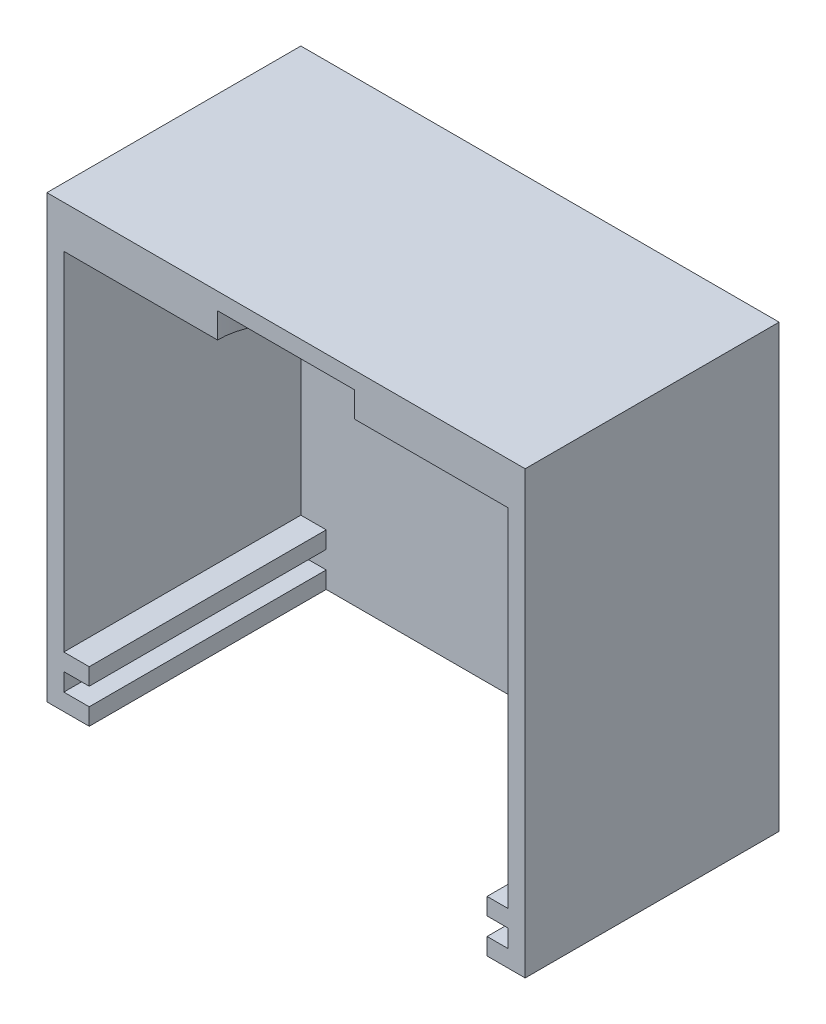
ISO-10303-21;
HEADER;
FILE_DESCRIPTION(('STEP AP214'),'2;1');
FILE_NAME('part.step','',(''),(''),'','','');
FILE_SCHEMA(('AUTOMOTIVE_DESIGN { 1 0 10303 214 1 1 1 1 }'));
ENDSEC;
DATA;
#1=APPLICATION_CONTEXT('core data for automotive mechanical design processes');
#2=APPLICATION_PROTOCOL_DEFINITION('international standard','automotive_design',2000,#1);
#3=PRODUCT_CONTEXT('',#1,'mechanical');
#4=PRODUCT('Part','Part','',(#3));
#5=PRODUCT_RELATED_PRODUCT_CATEGORY('part','',(#4));
#6=PRODUCT_DEFINITION_FORMATION('','',#4);
#7=PRODUCT_DEFINITION_CONTEXT('part definition',#1,'design');
#8=PRODUCT_DEFINITION('design','',#6,#7);
#9=PRODUCT_DEFINITION_SHAPE('','',#8);
#10=(LENGTH_UNIT() NAMED_UNIT(*) SI_UNIT(.MILLI.,.METRE.));
#11=(NAMED_UNIT(*) PLANE_ANGLE_UNIT() SI_UNIT($,.RADIAN.));
#12=(NAMED_UNIT(*) SI_UNIT($,.STERADIAN.) SOLID_ANGLE_UNIT());
#13=UNCERTAINTY_MEASURE_WITH_UNIT(LENGTH_MEASURE(1.E-05),#10,'distance_accuracy_value','');
#14=(GEOMETRIC_REPRESENTATION_CONTEXT(3) GLOBAL_UNCERTAINTY_ASSIGNED_CONTEXT((#13)) GLOBAL_UNIT_ASSIGNED_CONTEXT((#10,
#11,#12)) REPRESENTATION_CONTEXT('',''));
#15=CARTESIAN_POINT('',(0.,0.,0.));
#16=DIRECTION('',(0.,0.,1.));
#17=DIRECTION('',(1.,0.,0.));
#18=AXIS2_PLACEMENT_3D('',#15,#16,#17);
#19=CARTESIAN_POINT('',(0.,0.,2.));
#20=DIRECTION('',(0.,0.,1.));
#21=DIRECTION('',(1.,0.,0.));
#22=AXIS2_PLACEMENT_3D('',#19,#20,#21);
#23=PLANE('',#22);
#24=DIRECTION('',(0.,1.,0.));
#25=VECTOR('',#24,1.);
#26=CARTESIAN_POINT('',(-51.5,0.,2.));
#27=LINE('',#26,#25);
#28=CARTESIAN_POINT('',(-51.5,7.89999999999999,2.));
#29=VERTEX_POINT('',#28);
#30=CARTESIAN_POINT('',(-51.5,9.89999999999999,2.));
#31=VERTEX_POINT('',#30);
#32=EDGE_CURVE('E286',#29,#31,#27,.T.);
#33=ORIENTED_EDGE('',*,*,#32,.F.);
#34=DIRECTION('',(1.,0.,0.));
#35=VECTOR('',#34,1.);
#36=CARTESIAN_POINT('',(0.,7.9,2.));
#37=LINE('',#36,#35);
#38=CARTESIAN_POINT('',(-4.5,7.9,2.));
#39=VERTEX_POINT('',#38);
#40=EDGE_CURVE('E197',#29,#39,#37,.T.);
#41=ORIENTED_EDGE('',*,*,#40,.T.);
#42=DIRECTION('',(0.,-1.,0.));
#43=VECTOR('',#42,1.);
#44=CARTESIAN_POINT('',(-4.5,0.,2.));
#45=LINE('',#44,#43);
#46=CARTESIAN_POINT('',(-4.5,9.89999999999999,2.));
#47=VERTEX_POINT('',#46);
#48=EDGE_CURVE('E58',#47,#39,#45,.T.);
#49=ORIENTED_EDGE('',*,*,#48,.F.);
#50=DIRECTION('',(-1.,0.,0.));
#51=VECTOR('',#50,1.);
#52=CARTESIAN_POINT('',(0.,9.89999999999999,2.));
#53=LINE('',#52,#51);
#54=CARTESIAN_POINT('',(-2.,9.89999999999999,2.));
#55=VERTEX_POINT('',#54);
#56=EDGE_CURVE('E334',#55,#47,#53,.T.);
#57=ORIENTED_EDGE('',*,*,#56,.F.);
#58=DIRECTION('',(0.,1.,0.));
#59=VECTOR('',#58,1.);
#60=CARTESIAN_POINT('',(-2.,0.,2.));
#61=LINE('',#60,#59);
#62=CARTESIAN_POINT('',(-2.,12.,2.));
#63=VERTEX_POINT('',#62);
#64=EDGE_CURVE('E229',#55,#63,#61,.T.);
#65=ORIENTED_EDGE('',*,*,#64,.T.);
#66=DIRECTION('',(1.,0.,0.));
#67=VECTOR('',#66,1.);
#68=CARTESIAN_POINT('',(0.,12.,2.));
#69=LINE('',#68,#67);
#70=CARTESIAN_POINT('',(-4.5,12.,2.));
#71=VERTEX_POINT('',#70);
#72=EDGE_CURVE('E311',#71,#63,#69,.T.);
#73=ORIENTED_EDGE('',*,*,#72,.F.);
#74=DIRECTION('',(0.,-1.,0.));
#75=VECTOR('',#74,1.);
#76=CARTESIAN_POINT('',(-4.5,0.,2.));
#77=LINE('',#76,#75);
#78=CARTESIAN_POINT('',(-4.5,14.,2.));
#79=VERTEX_POINT('',#78);
#80=EDGE_CURVE('E317',#79,#71,#77,.T.);
#81=ORIENTED_EDGE('',*,*,#80,.F.);
#82=DIRECTION('',(-1.,0.,0.));
#83=VECTOR('',#82,1.);
#84=CARTESIAN_POINT('',(0.,14.,2.));
#85=LINE('',#84,#83);
#86=CARTESIAN_POINT('',(-2.,14.,2.));
#87=VERTEX_POINT('',#86);
#88=EDGE_CURVE('E299',#87,#79,#85,.T.);
#89=ORIENTED_EDGE('',*,*,#88,.F.);
#90=CARTESIAN_POINT('',(-2.,55.,2.));
#91=VERTEX_POINT('',#90);
#92=EDGE_CURVE('E231',#87,#91,#61,.T.);
#93=ORIENTED_EDGE('',*,*,#92,.T.);
#94=DIRECTION('',(1.,0.,0.));
#95=VECTOR('',#94,1.);
#96=CARTESIAN_POINT('',(-54.5,55.,2.));
#97=LINE('',#96,#95);
#98=CARTESIAN_POINT('',(-54.5,55.,2.));
#99=VERTEX_POINT('',#98);
#100=EDGE_CURVE('E238',#99,#91,#97,.T.);
#101=ORIENTED_EDGE('',*,*,#100,.F.);
#102=DIRECTION('',(0.,-1.,0.));
#103=VECTOR('',#102,1.);
#104=CARTESIAN_POINT('',(-54.5,0.,2.));
#105=LINE('',#104,#103);
#106=CARTESIAN_POINT('',(-54.5,14.,2.));
#107=VERTEX_POINT('',#106);
#108=EDGE_CURVE('E225',#99,#107,#105,.T.);
#109=ORIENTED_EDGE('',*,*,#108,.T.);
#110=DIRECTION('',(1.,0.,0.));
#111=VECTOR('',#110,1.);
#112=CARTESIAN_POINT('',(0.,14.,2.));
#113=LINE('',#112,#111);
#114=CARTESIAN_POINT('',(-51.5,14.,2.));
#115=VERTEX_POINT('',#114);
#116=EDGE_CURVE('E259',#107,#115,#113,.T.);
#117=ORIENTED_EDGE('',*,*,#116,.T.);
#118=DIRECTION('',(0.,1.,0.));
#119=VECTOR('',#118,1.);
#120=CARTESIAN_POINT('',(-51.5,0.,2.));
#121=LINE('',#120,#119);
#122=CARTESIAN_POINT('',(-51.5,12.,2.));
#123=VERTEX_POINT('',#122);
#124=EDGE_CURVE('E261',#123,#115,#121,.T.);
#125=ORIENTED_EDGE('',*,*,#124,.F.);
#126=DIRECTION('',(-1.,0.,0.));
#127=VECTOR('',#126,1.);
#128=CARTESIAN_POINT('',(0.,12.,2.));
#129=LINE('',#128,#127);
#130=CARTESIAN_POINT('',(-54.5,12.,2.));
#131=VERTEX_POINT('',#130);
#132=EDGE_CURVE('E253',#123,#131,#129,.T.);
#133=ORIENTED_EDGE('',*,*,#132,.T.);
#134=CARTESIAN_POINT('',(-54.5,9.89999999999999,2.));
#135=VERTEX_POINT('',#134);
#136=EDGE_CURVE('E228',#131,#135,#105,.T.);
#137=ORIENTED_EDGE('',*,*,#136,.T.);
#138=DIRECTION('',(1.,0.,0.));
#139=VECTOR('',#138,1.);
#140=CARTESIAN_POINT('',(0.,9.9,2.));
#141=LINE('',#140,#139);
#142=EDGE_CURVE('E278',#135,#31,#141,.T.);
#143=ORIENTED_EDGE('',*,*,#142,.T.);
#144=EDGE_LOOP('',(#33,#41,#49,#57,#65,#73,#81,#89,#93,#101,#109,#117,#125,#133,#137,#143));
#145=FACE_BOUND('',#144,.T.);
#146=ADVANCED_FACE('F35',(#145),#23,.T.);
#147=CARTESIAN_POINT('',(0.,0.,30.));
#148=DIRECTION('',(-1.,0.,0.));
#149=DIRECTION('',(0.,0.,1.));
#150=AXIS2_PLACEMENT_3D('',#147,#148,#149);
#151=PLANE('',#150);
#152=DIRECTION('',(0.,0.,1.));
#153=VECTOR('',#152,1.);
#154=CARTESIAN_POINT('',(0.,7.9,30.));
#155=LINE('',#154,#153);
#156=CARTESIAN_POINT('',(0.,7.9,0.));
#157=VERTEX_POINT('',#156);
#158=CARTESIAN_POINT('',(0.,7.9,30.));
#159=VERTEX_POINT('',#158);
#160=EDGE_CURVE('E185',#157,#159,#155,.T.);
#161=ORIENTED_EDGE('',*,*,#160,.F.);
#162=DIRECTION('',(0.,1.,0.));
#163=VECTOR('',#162,1.);
#164=CARTESIAN_POINT('',(0.,0.,0.));
#165=LINE('',#164,#163);
#166=CARTESIAN_POINT('',(0.,60.,0.));
#167=VERTEX_POINT('',#166);
#168=EDGE_CURVE('E194',#157,#167,#165,.T.);
#169=ORIENTED_EDGE('',*,*,#168,.T.);
#170=DIRECTION('',(0.,0.,-1.));
#171=VECTOR('',#170,1.);
#172=CARTESIAN_POINT('',(0.,60.,30.));
#173=LINE('',#172,#171);
#174=CARTESIAN_POINT('',(0.,60.,30.));
#175=VERTEX_POINT('',#174);
#176=EDGE_CURVE('E11',#175,#167,#173,.T.);
#177=ORIENTED_EDGE('',*,*,#176,.F.);
#178=DIRECTION('',(0.,1.,0.));
#179=VECTOR('',#178,1.);
#180=CARTESIAN_POINT('',(0.,0.,30.));
#181=LINE('',#180,#179);
#182=EDGE_CURVE('E196',#159,#175,#181,.T.);
#183=ORIENTED_EDGE('',*,*,#182,.F.);
#184=EDGE_LOOP('',(#161,#169,#177,#183));
#185=FACE_BOUND('',#184,.T.);
#186=ADVANCED_FACE('F37',(#185),#151,.F.);
#187=CARTESIAN_POINT('',(-56.5,0.,30.));
#188=DIRECTION('',(1.,0.,0.));
#189=DIRECTION('',(0.,0.,-1.));
#190=AXIS2_PLACEMENT_3D('',#187,#188,#189);
#191=PLANE('',#190);
#192=DIRECTION('',(0.,0.,-1.));
#193=VECTOR('',#192,1.);
#194=CARTESIAN_POINT('',(-56.5,7.89999999999999,30.));
#195=LINE('',#194,#193);
#196=CARTESIAN_POINT('',(-56.5,7.89999999999999,30.));
#197=VERTEX_POINT('',#196);
#198=CARTESIAN_POINT('',(-56.5,7.9,0.));
#199=VERTEX_POINT('',#198);
#200=EDGE_CURVE('E50',#197,#199,#195,.T.);
#201=ORIENTED_EDGE('',*,*,#200,.F.);
#202=DIRECTION('',(0.,-1.,0.));
#203=VECTOR('',#202,1.);
#204=CARTESIAN_POINT('',(-56.5,0.,30.));
#205=LINE('',#204,#203);
#206=CARTESIAN_POINT('',(-56.5,60.,30.));
#207=VERTEX_POINT('',#206);
#208=EDGE_CURVE('E208',#207,#197,#205,.T.);
#209=ORIENTED_EDGE('',*,*,#208,.F.);
#210=DIRECTION('',(0.,0.,-1.));
#211=VECTOR('',#210,1.);
#212=CARTESIAN_POINT('',(-56.5,60.,30.));
#213=LINE('',#212,#211);
#214=CARTESIAN_POINT('',(-56.5,60.,0.));
#215=VERTEX_POINT('',#214);
#216=EDGE_CURVE('E43',#207,#215,#213,.T.);
#217=ORIENTED_EDGE('',*,*,#216,.T.);
#218=DIRECTION('',(0.,-1.,0.));
#219=VECTOR('',#218,1.);
#220=CARTESIAN_POINT('',(-56.5,0.,0.));
#221=LINE('',#220,#219);
#222=EDGE_CURVE('E203',#215,#199,#221,.T.);
#223=ORIENTED_EDGE('',*,*,#222,.T.);
#224=EDGE_LOOP('',(#201,#209,#217,#223));
#225=FACE_BOUND('',#224,.T.);
#226=ADVANCED_FACE('F421',(#225),#191,.F.);
#227=CARTESIAN_POINT('',(0.,0.,30.));
#228=DIRECTION('',(0.,0.,1.));
#229=DIRECTION('',(1.,0.,0.));
#230=AXIS2_PLACEMENT_3D('',#227,#228,#229);
#231=PLANE('',#230);
#232=ORIENTED_EDGE('',*,*,#208,.T.);
#233=DIRECTION('',(-1.,0.,0.));
#234=VECTOR('',#233,1.);
#235=CARTESIAN_POINT('',(-51.5,7.89999999999999,30.));
#236=LINE('',#235,#234);
#237=CARTESIAN_POINT('',(-51.5,7.89999999999999,30.));
#238=VERTEX_POINT('',#237);
#239=EDGE_CURVE('E289',#238,#197,#236,.T.);
#240=ORIENTED_EDGE('',*,*,#239,.F.);
#241=DIRECTION('',(0.,-1.,0.));
#242=VECTOR('',#241,1.);
#243=CARTESIAN_POINT('',(-51.5,9.89999999999999,30.));
#244=LINE('',#243,#242);
#245=CARTESIAN_POINT('',(-51.5,9.89999999999999,30.));
#246=VERTEX_POINT('',#245);
#247=EDGE_CURVE('E298',#246,#238,#244,.T.);
#248=ORIENTED_EDGE('',*,*,#247,.F.);
#249=DIRECTION('',(-1.,0.,0.));
#250=VECTOR('',#249,1.);
#251=CARTESIAN_POINT('',(-51.5,9.89999999999999,30.));
#252=LINE('',#251,#250);
#253=CARTESIAN_POINT('',(-54.5,9.89999999999999,30.));
#254=VERTEX_POINT('',#253);
#255=EDGE_CURVE('E291',#246,#254,#252,.T.);
#256=ORIENTED_EDGE('',*,*,#255,.T.);
#257=DIRECTION('',(0.,-1.,0.));
#258=VECTOR('',#257,1.);
#259=CARTESIAN_POINT('',(-54.5,0.,30.));
#260=LINE('',#259,#258);
#261=CARTESIAN_POINT('',(-54.5,12.,30.));
#262=VERTEX_POINT('',#261);
#263=EDGE_CURVE('E205',#262,#254,#260,.T.);
#264=ORIENTED_EDGE('',*,*,#263,.F.);
#265=DIRECTION('',(-1.,0.,0.));
#266=VECTOR('',#265,1.);
#267=CARTESIAN_POINT('',(-51.5,12.,30.));
#268=LINE('',#267,#266);
#269=CARTESIAN_POINT('',(-51.5,12.,30.));
#270=VERTEX_POINT('',#269);
#271=EDGE_CURVE('E264',#270,#262,#268,.T.);
#272=ORIENTED_EDGE('',*,*,#271,.F.);
#273=DIRECTION('',(0.,-1.,0.));
#274=VECTOR('',#273,1.);
#275=CARTESIAN_POINT('',(-51.5,14.,30.));
#276=LINE('',#275,#274);
#277=CARTESIAN_POINT('',(-51.5,14.,30.));
#278=VERTEX_POINT('',#277);
#279=EDGE_CURVE('E274',#278,#270,#276,.T.);
#280=ORIENTED_EDGE('',*,*,#279,.F.);
#281=DIRECTION('',(-1.,0.,0.));
#282=VECTOR('',#281,1.);
#283=CARTESIAN_POINT('',(-51.5,14.,30.));
#284=LINE('',#283,#282);
#285=CARTESIAN_POINT('',(-54.5,14.,30.));
#286=VERTEX_POINT('',#285);
#287=EDGE_CURVE('E267',#278,#286,#284,.T.);
#288=ORIENTED_EDGE('',*,*,#287,.T.);
#289=CARTESIAN_POINT('',(-54.5,55.,30.));
#290=VERTEX_POINT('',#289);
#291=EDGE_CURVE('E201',#290,#286,#260,.T.);
#292=ORIENTED_EDGE('',*,*,#291,.F.);
#293=DIRECTION('',(1.,0.,0.));
#294=VECTOR('',#293,1.);
#295=CARTESIAN_POINT('',(-54.5,55.,30.));
#296=LINE('',#295,#294);
#297=CARTESIAN_POINT('',(-36.35,55.,30.));
#298=VERTEX_POINT('',#297);
#299=EDGE_CURVE('E237',#290,#298,#296,.T.);
#300=ORIENTED_EDGE('',*,*,#299,.T.);
#301=DIRECTION('',(0.,-1.,0.));
#302=VECTOR('',#301,1.);
#303=CARTESIAN_POINT('',(-36.35,58.,30.));
#304=LINE('',#303,#302);
#305=CARTESIAN_POINT('',(-36.35,58.,30.));
#306=VERTEX_POINT('',#305);
#307=EDGE_CURVE('E242',#306,#298,#304,.T.);
#308=ORIENTED_EDGE('',*,*,#307,.F.);
#309=DIRECTION('',(-1.,0.,0.));
#310=VECTOR('',#309,1.);
#311=CARTESIAN_POINT('',(-36.35,58.,30.));
#312=LINE('',#311,#310);
#313=CARTESIAN_POINT('',(-20.15,58.,30.));
#314=VERTEX_POINT('',#313);
#315=EDGE_CURVE('E248',#314,#306,#312,.T.);
#316=ORIENTED_EDGE('',*,*,#315,.F.);
#317=DIRECTION('',(0.,-1.,0.));
#318=VECTOR('',#317,1.);
#319=CARTESIAN_POINT('',(-20.15,58.,30.));
#320=LINE('',#319,#318);
#321=CARTESIAN_POINT('',(-20.15,55.,30.));
#322=VERTEX_POINT('',#321);
#323=EDGE_CURVE('E245',#314,#322,#320,.T.);
#324=ORIENTED_EDGE('',*,*,#323,.T.);
#325=CARTESIAN_POINT('',(-2.,55.,30.));
#326=VERTEX_POINT('',#325);
#327=EDGE_CURVE('E241',#322,#326,#296,.T.);
#328=ORIENTED_EDGE('',*,*,#327,.T.);
#329=DIRECTION('',(0.,1.,0.));
#330=VECTOR('',#329,1.);
#331=CARTESIAN_POINT('',(-2.,0.,30.));
#332=LINE('',#331,#330);
#333=CARTESIAN_POINT('',(-2.,14.,30.));
#334=VERTEX_POINT('',#333);
#335=EDGE_CURVE('E224',#334,#326,#332,.T.);
#336=ORIENTED_EDGE('',*,*,#335,.F.);
#337=DIRECTION('',(1.,0.,0.));
#338=VECTOR('',#337,1.);
#339=CARTESIAN_POINT('',(-4.5,14.,30.));
#340=LINE('',#339,#338);
#341=CARTESIAN_POINT('',(-4.5,14.,30.));
#342=VERTEX_POINT('',#341);
#343=EDGE_CURVE('E320',#342,#334,#340,.T.);
#344=ORIENTED_EDGE('',*,*,#343,.F.);
#345=DIRECTION('',(0.,-1.,0.));
#346=VECTOR('',#345,1.);
#347=CARTESIAN_POINT('',(-4.5,14.,30.));
#348=LINE('',#347,#346);
#349=CARTESIAN_POINT('',(-4.5,12.,30.));
#350=VERTEX_POINT('',#349);
#351=EDGE_CURVE('E331',#342,#350,#348,.T.);
#352=ORIENTED_EDGE('',*,*,#351,.T.);
#353=DIRECTION('',(1.,0.,0.));
#354=VECTOR('',#353,1.);
#355=CARTESIAN_POINT('',(-4.5,12.,30.));
#356=LINE('',#355,#354);
#357=CARTESIAN_POINT('',(-2.,12.,30.));
#358=VERTEX_POINT('',#357);
#359=EDGE_CURVE('E323',#350,#358,#356,.T.);
#360=ORIENTED_EDGE('',*,*,#359,.T.);
#361=CARTESIAN_POINT('',(-2.,9.89999999999999,30.));
#362=VERTEX_POINT('',#361);
#363=EDGE_CURVE('E222',#362,#358,#332,.T.);
#364=ORIENTED_EDGE('',*,*,#363,.F.);
#365=DIRECTION('',(1.,0.,0.));
#366=VECTOR('',#365,1.);
#367=CARTESIAN_POINT('',(-4.5,9.89999999999999,30.));
#368=LINE('',#367,#366);
#369=CARTESIAN_POINT('',(-4.5,9.89999999999999,30.));
#370=VERTEX_POINT('',#369);
#371=EDGE_CURVE('E340',#370,#362,#368,.T.);
#372=ORIENTED_EDGE('',*,*,#371,.F.);
#373=DIRECTION('',(0.,-1.,0.));
#374=VECTOR('',#373,1.);
#375=CARTESIAN_POINT('',(-4.5,9.89999999999999,30.));
#376=LINE('',#375,#374);
#377=CARTESIAN_POINT('',(-4.5,7.89999999999999,30.));
#378=VERTEX_POINT('',#377);
#379=EDGE_CURVE('E350',#370,#378,#376,.T.);
#380=ORIENTED_EDGE('',*,*,#379,.T.);
#381=DIRECTION('',(1.,0.,0.));
#382=VECTOR('',#381,1.);
#383=CARTESIAN_POINT('',(-4.5,7.89999999999999,30.));
#384=LINE('',#383,#382);
#385=EDGE_CURVE('E343',#378,#159,#384,.T.);
#386=ORIENTED_EDGE('',*,*,#385,.T.);
#387=ORIENTED_EDGE('',*,*,#182,.T.);
#388=DIRECTION('',(-1.,0.,0.));
#389=VECTOR('',#388,1.);
#390=CARTESIAN_POINT('',(0.,60.,30.));
#391=LINE('',#390,#389);
#392=EDGE_CURVE('E216',#175,#207,#391,.T.);
#393=ORIENTED_EDGE('',*,*,#392,.T.);
#394=EDGE_LOOP('',(#232,#240,#248,#256,#264,#272,#280,#288,#292,#300,#308,#316,#324,#328,#336,
#344,#352,#360,#364,#372,#380,#386,#387,#393));
#395=FACE_BOUND('',#394,.T.);
#396=ADVANCED_FACE('F361',(#395),#231,.T.);
#397=CARTESIAN_POINT('',(0.,0.,0.));
#398=DIRECTION('',(0.,0.,1.));
#399=DIRECTION('',(1.,0.,0.));
#400=AXIS2_PLACEMENT_3D('',#397,#398,#399);
#401=PLANE('',#400);
#402=DIRECTION('',(1.,0.,0.));
#403=VECTOR('',#402,1.);
#404=CARTESIAN_POINT('',(-56.5,7.89999999999999,0.));
#405=LINE('',#404,#403);
#406=EDGE_CURVE('E182',#199,#157,#405,.T.);
#407=ORIENTED_EDGE('',*,*,#406,.F.);
#408=ORIENTED_EDGE('',*,*,#222,.F.);
#409=DIRECTION('',(-1.,0.,0.));
#410=VECTOR('',#409,1.);
#411=CARTESIAN_POINT('',(0.,60.,0.));
#412=LINE('',#411,#410);
#413=EDGE_CURVE('E200',#167,#215,#412,.T.);
#414=ORIENTED_EDGE('',*,*,#413,.F.);
#415=ORIENTED_EDGE('',*,*,#168,.F.);
#416=EDGE_LOOP('',(#407,#408,#414,#415));
#417=FACE_BOUND('',#416,.T.);
#418=ADVANCED_FACE('F199',(#417),#401,.F.);
#419=CARTESIAN_POINT('',(-2.,0.,30.));
#420=DIRECTION('',(-1.,0.,0.));
#421=DIRECTION('',(0.,0.,1.));
#422=AXIS2_PLACEMENT_3D('',#419,#420,#421);
#423=PLANE('',#422);
#424=DIRECTION('',(0.,0.,-1.));
#425=VECTOR('',#424,1.);
#426=CARTESIAN_POINT('',(-2.,9.89999999999999,30.));
#427=LINE('',#426,#425);
#428=EDGE_CURVE('E336',#362,#55,#427,.T.);
#429=ORIENTED_EDGE('',*,*,#428,.F.);
#430=ORIENTED_EDGE('',*,*,#363,.T.);
#431=DIRECTION('',(0.,0.,1.));
#432=VECTOR('',#431,1.);
#433=CARTESIAN_POINT('',(-2.,12.,30.));
#434=LINE('',#433,#432);
#435=EDGE_CURVE('E314',#63,#358,#434,.T.);
#436=ORIENTED_EDGE('',*,*,#435,.F.);
#437=ORIENTED_EDGE('',*,*,#64,.F.);
#438=EDGE_LOOP('',(#429,#430,#436,#437));
#439=FACE_BOUND('',#438,.T.);
#440=ADVANCED_FACE('F368',(#439),#423,.T.);
#441=DIRECTION('',(0.,0.,-1.));
#442=VECTOR('',#441,1.);
#443=CARTESIAN_POINT('',(-2.,14.,30.));
#444=LINE('',#443,#442);
#445=EDGE_CURVE('E308',#334,#87,#444,.T.);
#446=ORIENTED_EDGE('',*,*,#445,.F.);
#447=ORIENTED_EDGE('',*,*,#335,.T.);
#448=DIRECTION('',(0.,0.,-1.));
#449=VECTOR('',#448,1.);
#450=CARTESIAN_POINT('',(-2.,55.,30.));
#451=LINE('',#450,#449);
#452=EDGE_CURVE('E234',#326,#91,#451,.T.);
#453=ORIENTED_EDGE('',*,*,#452,.T.);
#454=ORIENTED_EDGE('',*,*,#92,.F.);
#455=EDGE_LOOP('',(#446,#447,#453,#454));
#456=FACE_BOUND('',#455,.T.);
#457=ADVANCED_FACE('F384',(#456),#423,.T.);
#458=CARTESIAN_POINT('',(-54.5,0.,30.));
#459=DIRECTION('',(1.,0.,0.));
#460=DIRECTION('',(0.,0.,-1.));
#461=AXIS2_PLACEMENT_3D('',#458,#459,#460);
#462=PLANE('',#461);
#463=ORIENTED_EDGE('',*,*,#263,.T.);
#464=DIRECTION('',(0.,0.,1.));
#465=VECTOR('',#464,1.);
#466=CARTESIAN_POINT('',(-54.5,9.89999999999999,30.));
#467=LINE('',#466,#465);
#468=EDGE_CURVE('E295',#135,#254,#467,.T.);
#469=ORIENTED_EDGE('',*,*,#468,.F.);
#470=ORIENTED_EDGE('',*,*,#136,.F.);
#471=DIRECTION('',(0.,0.,-1.));
#472=VECTOR('',#471,1.);
#473=CARTESIAN_POINT('',(-54.5,12.,30.));
#474=LINE('',#473,#472);
#475=EDGE_CURVE('E275',#262,#131,#474,.T.);
#476=ORIENTED_EDGE('',*,*,#475,.F.);
#477=EDGE_LOOP('',(#463,#469,#470,#476));
#478=FACE_BOUND('',#477,.T.);
#479=ADVANCED_FACE('F413',(#478),#462,.T.);
#480=ORIENTED_EDGE('',*,*,#291,.T.);
#481=DIRECTION('',(0.,0.,1.));
#482=VECTOR('',#481,1.);
#483=CARTESIAN_POINT('',(-54.5,14.,30.));
#484=LINE('',#483,#482);
#485=EDGE_CURVE('E271',#107,#286,#484,.T.);
#486=ORIENTED_EDGE('',*,*,#485,.F.);
#487=ORIENTED_EDGE('',*,*,#108,.F.);
#488=DIRECTION('',(0.,0.,-1.));
#489=VECTOR('',#488,1.);
#490=CARTESIAN_POINT('',(-54.5,55.,30.));
#491=LINE('',#490,#489);
#492=EDGE_CURVE('E232',#290,#99,#491,.T.);
#493=ORIENTED_EDGE('',*,*,#492,.F.);
#494=EDGE_LOOP('',(#480,#486,#487,#493));
#495=FACE_BOUND('',#494,.T.);
#496=ADVANCED_FACE('F394',(#495),#462,.T.);
#497=CARTESIAN_POINT('',(0.,60.,30.));
#498=DIRECTION('',(0.,-1.,0.));
#499=DIRECTION('',(1.,0.,0.));
#500=AXIS2_PLACEMENT_3D('',#497,#498,#499);
#501=PLANE('',#500);
#502=ORIENTED_EDGE('',*,*,#413,.T.);
#503=ORIENTED_EDGE('',*,*,#216,.F.);
#504=ORIENTED_EDGE('',*,*,#392,.F.);
#505=ORIENTED_EDGE('',*,*,#176,.T.);
#506=EDGE_LOOP('',(#502,#503,#504,#505));
#507=FACE_BOUND('',#506,.T.);
#508=ADVANCED_FACE('F447',(#507),#501,.F.);
#509=CARTESIAN_POINT('',(-54.5,55.,30.));
#510=DIRECTION('',(0.,1.,0.));
#511=DIRECTION('',(-1.,0.,0.));
#512=AXIS2_PLACEMENT_3D('',#509,#510,#511);
#513=PLANE('',#512);
#514=ORIENTED_EDGE('',*,*,#327,.F.);
#515=CARTESIAN_POINT('',(-28.25,55.,30.));
#516=DIRECTION('',(0.,-1.,0.));
#517=DIRECTION('',(0.,0.,1.));
#518=AXIS2_PLACEMENT_3D('',#515,#516,#517);
#519=CIRCLE('',#518,8.1);
#520=EDGE_CURVE('E250',#298,#322,#519,.T.);
#521=ORIENTED_EDGE('',*,*,#520,.F.);
#522=ORIENTED_EDGE('',*,*,#299,.F.);
#523=ORIENTED_EDGE('',*,*,#492,.T.);
#524=ORIENTED_EDGE('',*,*,#100,.T.);
#525=ORIENTED_EDGE('',*,*,#452,.F.);
#526=EDGE_LOOP('',(#514,#521,#522,#523,#524,#525));
#527=FACE_BOUND('',#526,.T.);
#528=ADVANCED_FACE('F389',(#527),#513,.F.);
#529=CARTESIAN_POINT('',(-28.25,58.,30.));
#530=DIRECTION('',(0.,-1.,0.));
#531=DIRECTION('',(0.,0.,-1.));
#532=AXIS2_PLACEMENT_3D('',#529,#530,#531);
#533=CYLINDRICAL_SURFACE('',#532,8.1);
#534=ORIENTED_EDGE('',*,*,#520,.T.);
#535=ORIENTED_EDGE('',*,*,#323,.F.);
#536=CARTESIAN_POINT('',(-28.25,58.,30.));
#537=DIRECTION('',(0.,-1.,0.));
#538=DIRECTION('',(0.,0.,1.));
#539=AXIS2_PLACEMENT_3D('',#536,#537,#538);
#540=CIRCLE('',#539,8.1);
#541=EDGE_CURVE('E252',#306,#314,#540,.T.);
#542=ORIENTED_EDGE('',*,*,#541,.F.);
#543=ORIENTED_EDGE('',*,*,#307,.T.);
#544=EDGE_LOOP('',(#534,#535,#542,#543));
#545=FACE_BOUND('',#544,.T.);
#546=ADVANCED_FACE('F446',(#545),#533,.F.);
#547=CARTESIAN_POINT('',(-28.25,58.,30.));
#548=DIRECTION('',(0.,1.,0.));
#549=DIRECTION('',(0.,0.,1.));
#550=AXIS2_PLACEMENT_3D('',#547,#548,#549);
#551=PLANE('',#550);
#552=ORIENTED_EDGE('',*,*,#541,.T.);
#553=ORIENTED_EDGE('',*,*,#315,.T.);
#554=EDGE_LOOP('',(#552,#553));
#555=FACE_BOUND('',#554,.T.);
#556=ADVANCED_FACE('F450',(#555),#551,.F.);
#557=CARTESIAN_POINT('',(-51.5,12.,30.));
#558=DIRECTION('',(0.,1.,0.));
#559=DIRECTION('',(-1.,0.,0.));
#560=AXIS2_PLACEMENT_3D('',#557,#558,#559);
#561=PLANE('',#560);
#562=ORIENTED_EDGE('',*,*,#132,.F.);
#563=DIRECTION('',(0.,0.,-1.));
#564=VECTOR('',#563,1.);
#565=CARTESIAN_POINT('',(-51.5,12.,30.));
#566=LINE('',#565,#564);
#567=EDGE_CURVE('E280',#270,#123,#566,.T.);
#568=ORIENTED_EDGE('',*,*,#567,.F.);
#569=ORIENTED_EDGE('',*,*,#271,.T.);
#570=ORIENTED_EDGE('',*,*,#475,.T.);
#571=EDGE_LOOP('',(#562,#568,#569,#570));
#572=FACE_BOUND('',#571,.T.);
#573=ADVANCED_FACE('F407',(#572),#561,.F.);
#574=CARTESIAN_POINT('',(-51.5,14.,30.));
#575=DIRECTION('',(0.,-1.,0.));
#576=DIRECTION('',(1.,0.,0.));
#577=AXIS2_PLACEMENT_3D('',#574,#575,#576);
#578=PLANE('',#577);
#579=ORIENTED_EDGE('',*,*,#116,.F.);
#580=ORIENTED_EDGE('',*,*,#485,.T.);
#581=ORIENTED_EDGE('',*,*,#287,.F.);
#582=DIRECTION('',(0.,0.,1.));
#583=VECTOR('',#582,1.);
#584=CARTESIAN_POINT('',(-51.5,14.,30.));
#585=LINE('',#584,#583);
#586=EDGE_CURVE('E270',#115,#278,#585,.T.);
#587=ORIENTED_EDGE('',*,*,#586,.F.);
#588=EDGE_LOOP('',(#579,#580,#581,#587));
#589=FACE_BOUND('',#588,.T.);
#590=ADVANCED_FACE('F402',(#589),#578,.F.);
#591=CARTESIAN_POINT('',(-51.5,0.,0.));
#592=DIRECTION('',(1.,0.,0.));
#593=DIRECTION('',(0.,0.,-1.));
#594=AXIS2_PLACEMENT_3D('',#591,#592,#593);
#595=PLANE('',#594);
#596=ORIENTED_EDGE('',*,*,#567,.T.);
#597=ORIENTED_EDGE('',*,*,#124,.T.);
#598=ORIENTED_EDGE('',*,*,#586,.T.);
#599=ORIENTED_EDGE('',*,*,#279,.T.);
#600=EDGE_LOOP('',(#596,#597,#598,#599));
#601=FACE_BOUND('',#600,.T.);
#602=ADVANCED_FACE('F405',(#601),#595,.T.);
#603=CARTESIAN_POINT('',(-51.5,7.89999999999999,30.));
#604=DIRECTION('',(0.,1.,0.));
#605=DIRECTION('',(-1.,0.,0.));
#606=AXIS2_PLACEMENT_3D('',#603,#604,#605);
#607=PLANE('',#606);
#608=ORIENTED_EDGE('',*,*,#239,.T.);
#609=ORIENTED_EDGE('',*,*,#200,.T.);
#610=ORIENTED_EDGE('',*,*,#406,.T.);
#611=ORIENTED_EDGE('',*,*,#160,.T.);
#612=ORIENTED_EDGE('',*,*,#385,.F.);
#613=DIRECTION('',(0.,0.,-1.));
#614=VECTOR('',#613,1.);
#615=CARTESIAN_POINT('',(-4.5,7.89999999999999,30.));
#616=LINE('',#615,#614);
#617=EDGE_CURVE('E345',#378,#39,#616,.T.);
#618=ORIENTED_EDGE('',*,*,#617,.T.);
#619=ORIENTED_EDGE('',*,*,#40,.F.);
#620=DIRECTION('',(0.,0.,-1.));
#621=VECTOR('',#620,1.);
#622=CARTESIAN_POINT('',(-51.5,7.89999999999999,30.));
#623=LINE('',#622,#621);
#624=EDGE_CURVE('E301',#238,#29,#623,.T.);
#625=ORIENTED_EDGE('',*,*,#624,.F.);
#626=EDGE_LOOP('',(#608,#609,#610,#611,#612,#618,#619,#625));
#627=FACE_BOUND('',#626,.T.);
#628=ADVANCED_FACE('F184',(#627),#607,.F.);
#629=CARTESIAN_POINT('',(-51.5,9.89999999999999,30.));
#630=DIRECTION('',(0.,-1.,0.));
#631=DIRECTION('',(1.,0.,0.));
#632=AXIS2_PLACEMENT_3D('',#629,#630,#631);
#633=PLANE('',#632);
#634=ORIENTED_EDGE('',*,*,#142,.F.);
#635=ORIENTED_EDGE('',*,*,#468,.T.);
#636=ORIENTED_EDGE('',*,*,#255,.F.);
#637=DIRECTION('',(0.,0.,1.));
#638=VECTOR('',#637,1.);
#639=CARTESIAN_POINT('',(-51.5,9.89999999999999,30.));
#640=LINE('',#639,#638);
#641=EDGE_CURVE('E294',#31,#246,#640,.T.);
#642=ORIENTED_EDGE('',*,*,#641,.F.);
#643=EDGE_LOOP('',(#634,#635,#636,#642));
#644=FACE_BOUND('',#643,.T.);
#645=ADVANCED_FACE('F416',(#644),#633,.F.);
#646=CARTESIAN_POINT('',(-51.5,0.,0.));
#647=DIRECTION('',(1.,0.,0.));
#648=DIRECTION('',(0.,0.,-1.));
#649=AXIS2_PLACEMENT_3D('',#646,#647,#648);
#650=PLANE('',#649);
#651=ORIENTED_EDGE('',*,*,#624,.T.);
#652=ORIENTED_EDGE('',*,*,#32,.T.);
#653=ORIENTED_EDGE('',*,*,#641,.T.);
#654=ORIENTED_EDGE('',*,*,#247,.T.);
#655=EDGE_LOOP('',(#651,#652,#653,#654));
#656=FACE_BOUND('',#655,.T.);
#657=ADVANCED_FACE('F420',(#656),#650,.T.);
#658=CARTESIAN_POINT('',(-4.5,14.,30.));
#659=DIRECTION('',(0.,1.,0.));
#660=DIRECTION('',(-1.,0.,0.));
#661=AXIS2_PLACEMENT_3D('',#658,#659,#660);
#662=PLANE('',#661);
#663=ORIENTED_EDGE('',*,*,#445,.T.);
#664=ORIENTED_EDGE('',*,*,#88,.T.);
#665=DIRECTION('',(0.,0.,1.));
#666=VECTOR('',#665,1.);
#667=CARTESIAN_POINT('',(-4.5,14.,30.));
#668=LINE('',#667,#666);
#669=EDGE_CURVE('E329',#79,#342,#668,.T.);
#670=ORIENTED_EDGE('',*,*,#669,.T.);
#671=ORIENTED_EDGE('',*,*,#343,.T.);
#672=EDGE_LOOP('',(#663,#664,#670,#671));
#673=FACE_BOUND('',#672,.T.);
#674=ADVANCED_FACE('F378',(#673),#662,.T.);
#675=CARTESIAN_POINT('',(-4.5,12.,30.));
#676=DIRECTION('',(0.,-1.,0.));
#677=DIRECTION('',(1.,0.,0.));
#678=AXIS2_PLACEMENT_3D('',#675,#676,#677);
#679=PLANE('',#678);
#680=DIRECTION('',(0.,0.,-1.));
#681=VECTOR('',#680,1.);
#682=CARTESIAN_POINT('',(-4.5,12.,30.));
#683=LINE('',#682,#681);
#684=EDGE_CURVE('E326',#350,#71,#683,.T.);
#685=ORIENTED_EDGE('',*,*,#684,.T.);
#686=ORIENTED_EDGE('',*,*,#72,.T.);
#687=ORIENTED_EDGE('',*,*,#435,.T.);
#688=ORIENTED_EDGE('',*,*,#359,.F.);
#689=EDGE_LOOP('',(#685,#686,#687,#688));
#690=FACE_BOUND('',#689,.T.);
#691=ADVANCED_FACE('F370',(#690),#679,.T.);
#692=CARTESIAN_POINT('',(-4.5,0.,0.));
#693=DIRECTION('',(-1.,0.,0.));
#694=DIRECTION('',(0.,0.,-1.));
#695=AXIS2_PLACEMENT_3D('',#692,#693,#694);
#696=PLANE('',#695);
#697=ORIENTED_EDGE('',*,*,#669,.F.);
#698=ORIENTED_EDGE('',*,*,#80,.T.);
#699=ORIENTED_EDGE('',*,*,#684,.F.);
#700=ORIENTED_EDGE('',*,*,#351,.F.);
#701=EDGE_LOOP('',(#697,#698,#699,#700));
#702=FACE_BOUND('',#701,.T.);
#703=ADVANCED_FACE('F374',(#702),#696,.T.);
#704=CARTESIAN_POINT('',(-4.5,9.89999999999999,30.));
#705=DIRECTION('',(0.,1.,0.));
#706=DIRECTION('',(-1.,0.,0.));
#707=AXIS2_PLACEMENT_3D('',#704,#705,#706);
#708=PLANE('',#707);
#709=ORIENTED_EDGE('',*,*,#428,.T.);
#710=ORIENTED_EDGE('',*,*,#56,.T.);
#711=DIRECTION('',(0.,0.,1.));
#712=VECTOR('',#711,1.);
#713=CARTESIAN_POINT('',(-4.5,9.89999999999999,30.));
#714=LINE('',#713,#712);
#715=EDGE_CURVE('E348',#47,#370,#714,.T.);
#716=ORIENTED_EDGE('',*,*,#715,.T.);
#717=ORIENTED_EDGE('',*,*,#371,.T.);
#718=EDGE_LOOP('',(#709,#710,#716,#717));
#719=FACE_BOUND('',#718,.T.);
#720=ADVANCED_FACE('F364',(#719),#708,.T.);
#721=CARTESIAN_POINT('',(-4.5,0.,0.));
#722=DIRECTION('',(-1.,0.,0.));
#723=DIRECTION('',(0.,0.,-1.));
#724=AXIS2_PLACEMENT_3D('',#721,#722,#723);
#725=PLANE('',#724);
#726=ORIENTED_EDGE('',*,*,#715,.F.);
#727=ORIENTED_EDGE('',*,*,#48,.T.);
#728=ORIENTED_EDGE('',*,*,#617,.F.);
#729=ORIENTED_EDGE('',*,*,#379,.F.);
#730=EDGE_LOOP('',(#726,#727,#728,#729));
#731=FACE_BOUND('',#730,.T.);
#732=ADVANCED_FACE('F358',(#731),#725,.T.);
#733=CLOSED_SHELL('',(#146,#186,#226,#396,#418,#440,#457,#479,#496,#508,#528,#546,#556,#573,
#590,#602,#628,#645,#657,#674,#691,#703,#720,#732));
#734=MANIFOLD_SOLID_BREP('B2',#733);
#735=ADVANCED_BREP_SHAPE_REPRESENTATION('',(#18,#734),#14);
#736=SHAPE_DEFINITION_REPRESENTATION(#9,#735);
ENDSEC;
END-ISO-10303-21;
